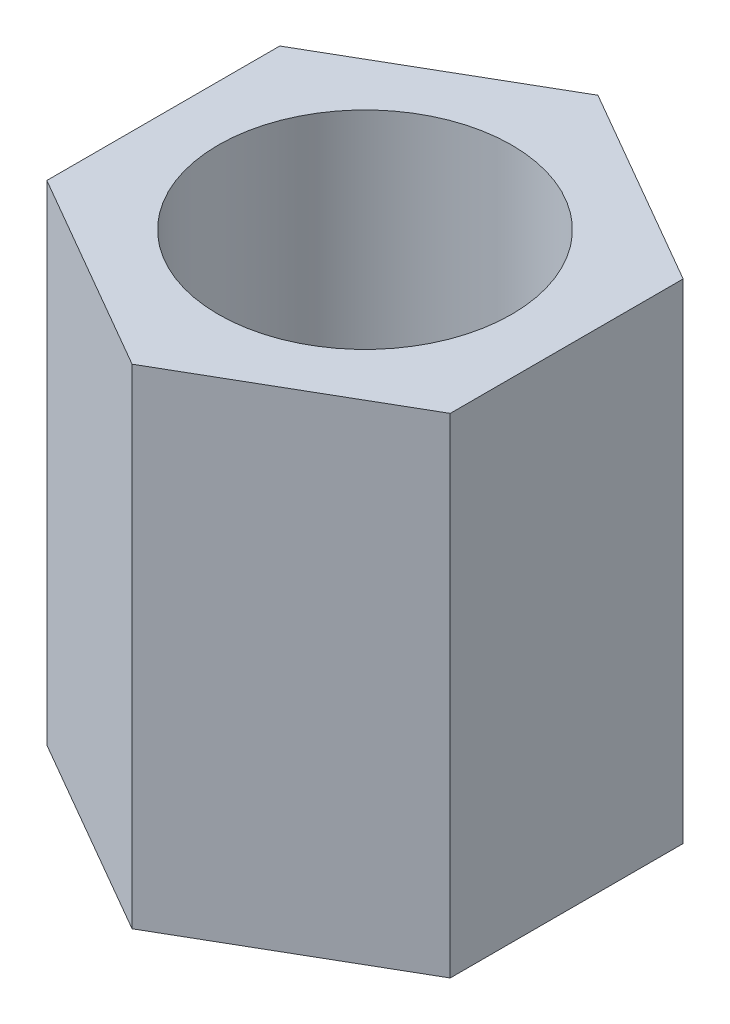
ISO-10303-21;
HEADER;
FILE_DESCRIPTION(('STEP AP214'),'2;1');
FILE_NAME('part.step','',(''),(''),'','','');
FILE_SCHEMA(('AUTOMOTIVE_DESIGN { 1 0 10303 214 1 1 1 1 }'));
ENDSEC;
DATA;
#1=APPLICATION_CONTEXT('core data for automotive mechanical design processes');
#2=APPLICATION_PROTOCOL_DEFINITION('international standard','automotive_design',2000,#1);
#3=PRODUCT_CONTEXT('',#1,'mechanical');
#4=PRODUCT('Part','Part','',(#3));
#5=PRODUCT_RELATED_PRODUCT_CATEGORY('part','',(#4));
#6=PRODUCT_DEFINITION_FORMATION('','',#4);
#7=PRODUCT_DEFINITION_CONTEXT('part definition',#1,'design');
#8=PRODUCT_DEFINITION('design','',#6,#7);
#9=PRODUCT_DEFINITION_SHAPE('','',#8);
#10=(LENGTH_UNIT() NAMED_UNIT(*) SI_UNIT(.MILLI.,.METRE.));
#11=(NAMED_UNIT(*) PLANE_ANGLE_UNIT() SI_UNIT($,.RADIAN.));
#12=(NAMED_UNIT(*) SI_UNIT($,.STERADIAN.) SOLID_ANGLE_UNIT());
#13=UNCERTAINTY_MEASURE_WITH_UNIT(LENGTH_MEASURE(1.E-05),#10,'distance_accuracy_value','');
#14=(GEOMETRIC_REPRESENTATION_CONTEXT(3) GLOBAL_UNCERTAINTY_ASSIGNED_CONTEXT((#13)) GLOBAL_UNIT_ASSIGNED_CONTEXT((#10,
#11,#12)) REPRESENTATION_CONTEXT('',''));
#15=CARTESIAN_POINT('',(0.,0.,0.));
#16=DIRECTION('',(0.,0.,1.));
#17=DIRECTION('',(1.,0.,0.));
#18=AXIS2_PLACEMENT_3D('',#15,#16,#17);
#19=CARTESIAN_POINT('',(0.,10.,0.));
#20=DIRECTION('',(0.,1.,0.));
#21=DIRECTION('',(0.,0.,1.));
#22=AXIS2_PLACEMENT_3D('',#19,#20,#21);
#23=PLANE('',#22);
#24=DIRECTION('',(-0.866025403784439,0.,-0.5));
#25=VECTOR('',#24,1.);
#26=CARTESIAN_POINT('',(4.125,10.,-2.38156986040721));
#27=LINE('',#26,#25);
#28=CARTESIAN_POINT('',(4.125,10.,-2.38156986040721));
#29=VERTEX_POINT('',#28);
#30=CARTESIAN_POINT('',(0.,10.,-4.76313972081441));
#31=VERTEX_POINT('',#30);
#32=EDGE_CURVE('E129',#29,#31,#27,.T.);
#33=ORIENTED_EDGE('',*,*,#32,.T.);
#34=DIRECTION('',(-0.866025403784439,0.,0.5));
#35=VECTOR('',#34,1.);
#36=CARTESIAN_POINT('',(0.,10.,-4.76313972081441));
#37=LINE('',#36,#35);
#38=CARTESIAN_POINT('',(-4.125,10.,-2.38156986040721));
#39=VERTEX_POINT('',#38);
#40=EDGE_CURVE('E87',#31,#39,#37,.T.);
#41=ORIENTED_EDGE('',*,*,#40,.T.);
#42=DIRECTION('',(0.,0.,1.));
#43=VECTOR('',#42,1.);
#44=CARTESIAN_POINT('',(-4.125,10.,-2.38156986040721));
#45=LINE('',#44,#43);
#46=CARTESIAN_POINT('',(-4.125,10.,2.38156986040721));
#47=VERTEX_POINT('',#46);
#48=EDGE_CURVE('E100',#39,#47,#45,.T.);
#49=ORIENTED_EDGE('',*,*,#48,.T.);
#50=DIRECTION('',(0.866025403784439,0.,0.5));
#51=VECTOR('',#50,1.);
#52=CARTESIAN_POINT('',(-4.125,10.,2.38156986040721));
#53=LINE('',#52,#51);
#54=CARTESIAN_POINT('',(0.,10.,4.76313972081441));
#55=VERTEX_POINT('',#54);
#56=EDGE_CURVE('E94',#47,#55,#53,.T.);
#57=ORIENTED_EDGE('',*,*,#56,.T.);
#58=DIRECTION('',(0.866025403784439,0.,-0.5));
#59=VECTOR('',#58,1.);
#60=CARTESIAN_POINT('',(0.,10.,4.76313972081441));
#61=LINE('',#60,#59);
#62=CARTESIAN_POINT('',(4.125,10.,2.38156986040721));
#63=VERTEX_POINT('',#62);
#64=EDGE_CURVE('E98',#55,#63,#61,.T.);
#65=ORIENTED_EDGE('',*,*,#64,.T.);
#66=DIRECTION('',(0.,0.,-1.));
#67=VECTOR('',#66,1.);
#68=CARTESIAN_POINT('',(4.125,10.,2.38156986040721));
#69=LINE('',#68,#67);
#70=EDGE_CURVE('E50',#63,#29,#69,.T.);
#71=ORIENTED_EDGE('',*,*,#70,.T.);
#72=EDGE_LOOP('',(#33,#41,#49,#57,#65,#71));
#73=FACE_BOUND('',#72,.T.);
#74=CARTESIAN_POINT('',(0.,10.,0.));
#75=DIRECTION('',(0.,1.,0.));
#76=DIRECTION('',(0.,0.,1.));
#77=AXIS2_PLACEMENT_3D('',#74,#75,#76);
#78=CIRCLE('',#77,3.);
#79=CARTESIAN_POINT('',(0.,10.,3.));
#80=VERTEX_POINT('',#79);
#81=EDGE_CURVE('E122',#80,#80,#78,.T.);
#82=ORIENTED_EDGE('',*,*,#81,.F.);
#83=EDGE_LOOP('',(#82));
#84=FACE_BOUND('',#83,.T.);
#85=ADVANCED_FACE('F33',(#73,#84),#23,.T.);
#86=CARTESIAN_POINT('',(0.,0.,0.));
#87=DIRECTION('',(0.,1.,0.));
#88=DIRECTION('',(0.,0.,1.));
#89=AXIS2_PLACEMENT_3D('',#86,#87,#88);
#90=PLANE('',#89);
#91=DIRECTION('',(-0.866025403784439,0.,-0.5));
#92=VECTOR('',#91,1.);
#93=CARTESIAN_POINT('',(4.125,0.,-2.38156986040721));
#94=LINE('',#93,#92);
#95=CARTESIAN_POINT('',(4.125,0.,-2.38156986040721));
#96=VERTEX_POINT('',#95);
#97=CARTESIAN_POINT('',(0.,0.,-4.76313972081441));
#98=VERTEX_POINT('',#97);
#99=EDGE_CURVE('E118',#96,#98,#94,.T.);
#100=ORIENTED_EDGE('',*,*,#99,.F.);
#101=DIRECTION('',(0.,0.,-1.));
#102=VECTOR('',#101,1.);
#103=CARTESIAN_POINT('',(4.125,0.,2.38156986040721));
#104=LINE('',#103,#102);
#105=CARTESIAN_POINT('',(4.125,0.,2.38156986040721));
#106=VERTEX_POINT('',#105);
#107=EDGE_CURVE('E79',#106,#96,#104,.T.);
#108=ORIENTED_EDGE('',*,*,#107,.F.);
#109=DIRECTION('',(0.866025403784439,0.,-0.5));
#110=VECTOR('',#109,1.);
#111=CARTESIAN_POINT('',(0.,0.,4.76313972081441));
#112=LINE('',#111,#110);
#113=CARTESIAN_POINT('',(0.,0.,4.76313972081441));
#114=VERTEX_POINT('',#113);
#115=EDGE_CURVE('E73',#114,#106,#112,.T.);
#116=ORIENTED_EDGE('',*,*,#115,.F.);
#117=DIRECTION('',(0.866025403784439,0.,0.5));
#118=VECTOR('',#117,1.);
#119=CARTESIAN_POINT('',(-4.125,0.,2.38156986040721));
#120=LINE('',#119,#118);
#121=CARTESIAN_POINT('',(-4.125,0.,2.38156986040721));
#122=VERTEX_POINT('',#121);
#123=EDGE_CURVE('E108',#122,#114,#120,.T.);
#124=ORIENTED_EDGE('',*,*,#123,.F.);
#125=DIRECTION('',(0.,0.,1.));
#126=VECTOR('',#125,1.);
#127=CARTESIAN_POINT('',(-4.125,0.,-2.38156986040721));
#128=LINE('',#127,#126);
#129=CARTESIAN_POINT('',(-4.125,0.,-2.38156986040721));
#130=VERTEX_POINT('',#129);
#131=EDGE_CURVE('E124',#130,#122,#128,.T.);
#132=ORIENTED_EDGE('',*,*,#131,.F.);
#133=DIRECTION('',(-0.866025403784439,0.,0.5));
#134=VECTOR('',#133,1.);
#135=CARTESIAN_POINT('',(0.,0.,-4.76313972081441));
#136=LINE('',#135,#134);
#137=EDGE_CURVE('E121',#98,#130,#136,.T.);
#138=ORIENTED_EDGE('',*,*,#137,.F.);
#139=EDGE_LOOP('',(#100,#108,#116,#124,#132,#138));
#140=FACE_BOUND('',#139,.T.);
#141=CARTESIAN_POINT('',(0.,0.,0.));
#142=DIRECTION('',(0.,1.,0.));
#143=DIRECTION('',(0.,0.,1.));
#144=AXIS2_PLACEMENT_3D('',#141,#142,#143);
#145=CIRCLE('',#144,3.);
#146=CARTESIAN_POINT('',(0.,0.,3.));
#147=VERTEX_POINT('',#146);
#148=EDGE_CURVE('E222',#147,#147,#145,.T.);
#149=ORIENTED_EDGE('',*,*,#148,.T.);
#150=EDGE_LOOP('',(#149));
#151=FACE_BOUND('',#150,.T.);
#152=ADVANCED_FACE('F138',(#140,#151),#90,.F.);
#153=CARTESIAN_POINT('',(4.125,10.,-2.38156986040721));
#154=DIRECTION('',(-0.5,0.,0.866025403784439));
#155=DIRECTION('',(0.866025403784439,0.,0.5));
#156=AXIS2_PLACEMENT_3D('',#153,#154,#155);
#157=PLANE('',#156);
#158=ORIENTED_EDGE('',*,*,#99,.T.);
#159=DIRECTION('',(0.,-1.,0.));
#160=VECTOR('',#159,1.);
#161=CARTESIAN_POINT('',(0.,10.,-4.76313972081441));
#162=LINE('',#161,#160);
#163=EDGE_CURVE('E11',#31,#98,#162,.T.);
#164=ORIENTED_EDGE('',*,*,#163,.F.);
#165=ORIENTED_EDGE('',*,*,#32,.F.);
#166=DIRECTION('',(0.,-1.,0.));
#167=VECTOR('',#166,1.);
#168=CARTESIAN_POINT('',(4.125,10.,-2.38156986040721));
#169=LINE('',#168,#167);
#170=EDGE_CURVE('E114',#29,#96,#169,.T.);
#171=ORIENTED_EDGE('',*,*,#170,.T.);
#172=EDGE_LOOP('',(#158,#164,#165,#171));
#173=FACE_BOUND('',#172,.T.);
#174=ADVANCED_FACE('F35',(#173),#157,.F.);
#175=CARTESIAN_POINT('',(0.,10.,-4.76313972081441));
#176=DIRECTION('',(0.5,0.,0.866025403784439));
#177=DIRECTION('',(0.866025403784439,0.,-0.5));
#178=AXIS2_PLACEMENT_3D('',#175,#176,#177);
#179=PLANE('',#178);
#180=ORIENTED_EDGE('',*,*,#137,.T.);
#181=DIRECTION('',(0.,-1.,0.));
#182=VECTOR('',#181,1.);
#183=CARTESIAN_POINT('',(-4.125,10.,-2.38156986040721));
#184=LINE('',#183,#182);
#185=EDGE_CURVE('E42',#39,#130,#184,.T.);
#186=ORIENTED_EDGE('',*,*,#185,.F.);
#187=ORIENTED_EDGE('',*,*,#40,.F.);
#188=ORIENTED_EDGE('',*,*,#163,.T.);
#189=EDGE_LOOP('',(#180,#186,#187,#188));
#190=FACE_BOUND('',#189,.T.);
#191=ADVANCED_FACE('F163',(#190),#179,.F.);
#192=CARTESIAN_POINT('',(-4.125,10.,-2.38156986040721));
#193=DIRECTION('',(1.,0.,0.));
#194=DIRECTION('',(0.,0.,-1.));
#195=AXIS2_PLACEMENT_3D('',#192,#193,#194);
#196=PLANE('',#195);
#197=ORIENTED_EDGE('',*,*,#131,.T.);
#198=DIRECTION('',(0.,-1.,0.));
#199=VECTOR('',#198,1.);
#200=CARTESIAN_POINT('',(-4.125,10.,2.38156986040721));
#201=LINE('',#200,#199);
#202=EDGE_CURVE('E109',#47,#122,#201,.T.);
#203=ORIENTED_EDGE('',*,*,#202,.F.);
#204=ORIENTED_EDGE('',*,*,#48,.F.);
#205=ORIENTED_EDGE('',*,*,#185,.T.);
#206=EDGE_LOOP('',(#197,#203,#204,#205));
#207=FACE_BOUND('',#206,.T.);
#208=ADVANCED_FACE('F135',(#207),#196,.F.);
#209=CARTESIAN_POINT('',(-4.125,10.,2.38156986040721));
#210=DIRECTION('',(0.5,0.,-0.866025403784439));
#211=DIRECTION('',(-0.866025403784439,0.,-0.5));
#212=AXIS2_PLACEMENT_3D('',#209,#210,#211);
#213=PLANE('',#212);
#214=ORIENTED_EDGE('',*,*,#123,.T.);
#215=DIRECTION('',(0.,-1.,0.));
#216=VECTOR('',#215,1.);
#217=CARTESIAN_POINT('',(0.,10.,4.76313972081441));
#218=LINE('',#217,#216);
#219=EDGE_CURVE('E105',#55,#114,#218,.T.);
#220=ORIENTED_EDGE('',*,*,#219,.F.);
#221=ORIENTED_EDGE('',*,*,#56,.F.);
#222=ORIENTED_EDGE('',*,*,#202,.T.);
#223=EDGE_LOOP('',(#214,#220,#221,#222));
#224=FACE_BOUND('',#223,.T.);
#225=ADVANCED_FACE('F106',(#224),#213,.F.);
#226=CARTESIAN_POINT('',(0.,10.,4.76313972081441));
#227=DIRECTION('',(-0.5,0.,-0.866025403784439));
#228=DIRECTION('',(-0.866025403784439,0.,0.5));
#229=AXIS2_PLACEMENT_3D('',#226,#227,#228);
#230=PLANE('',#229);
#231=ORIENTED_EDGE('',*,*,#115,.T.);
#232=DIRECTION('',(0.,-1.,0.));
#233=VECTOR('',#232,1.);
#234=CARTESIAN_POINT('',(4.125,10.,2.38156986040721));
#235=LINE('',#234,#233);
#236=EDGE_CURVE('E110',#63,#106,#235,.T.);
#237=ORIENTED_EDGE('',*,*,#236,.F.);
#238=ORIENTED_EDGE('',*,*,#64,.F.);
#239=ORIENTED_EDGE('',*,*,#219,.T.);
#240=EDGE_LOOP('',(#231,#237,#238,#239));
#241=FACE_BOUND('',#240,.T.);
#242=ADVANCED_FACE('F112',(#241),#230,.F.);
#243=CARTESIAN_POINT('',(4.125,10.,2.38156986040721));
#244=DIRECTION('',(-1.,0.,0.));
#245=DIRECTION('',(0.,0.,1.));
#246=AXIS2_PLACEMENT_3D('',#243,#244,#245);
#247=PLANE('',#246);
#248=ORIENTED_EDGE('',*,*,#107,.T.);
#249=ORIENTED_EDGE('',*,*,#170,.F.);
#250=ORIENTED_EDGE('',*,*,#70,.F.);
#251=ORIENTED_EDGE('',*,*,#236,.T.);
#252=EDGE_LOOP('',(#248,#249,#250,#251));
#253=FACE_BOUND('',#252,.T.);
#254=ADVANCED_FACE('F143',(#253),#247,.F.);
#255=CARTESIAN_POINT('',(0.,10.,0.));
#256=DIRECTION('',(0.,-1.,0.));
#257=DIRECTION('',(0.,0.,-1.));
#258=AXIS2_PLACEMENT_3D('',#255,#256,#257);
#259=CYLINDRICAL_SURFACE('',#258,3.);
#260=ORIENTED_EDGE('',*,*,#81,.T.);
#261=EDGE_LOOP('',(#260));
#262=FACE_BOUND('',#261,.T.);
#263=ORIENTED_EDGE('',*,*,#148,.F.);
#264=EDGE_LOOP('',(#263));
#265=FACE_BOUND('',#264,.T.);
#266=ADVANCED_FACE('F145',(#262,#265),#259,.F.);
#267=CLOSED_SHELL('',(#85,#152,#174,#191,#208,#225,#242,#254,#266));
#268=MANIFOLD_SOLID_BREP('B2',#267);
#269=ADVANCED_BREP_SHAPE_REPRESENTATION('',(#18,#268),#14);
#270=SHAPE_DEFINITION_REPRESENTATION(#9,#269);
ENDSEC;
END-ISO-10303-21;
